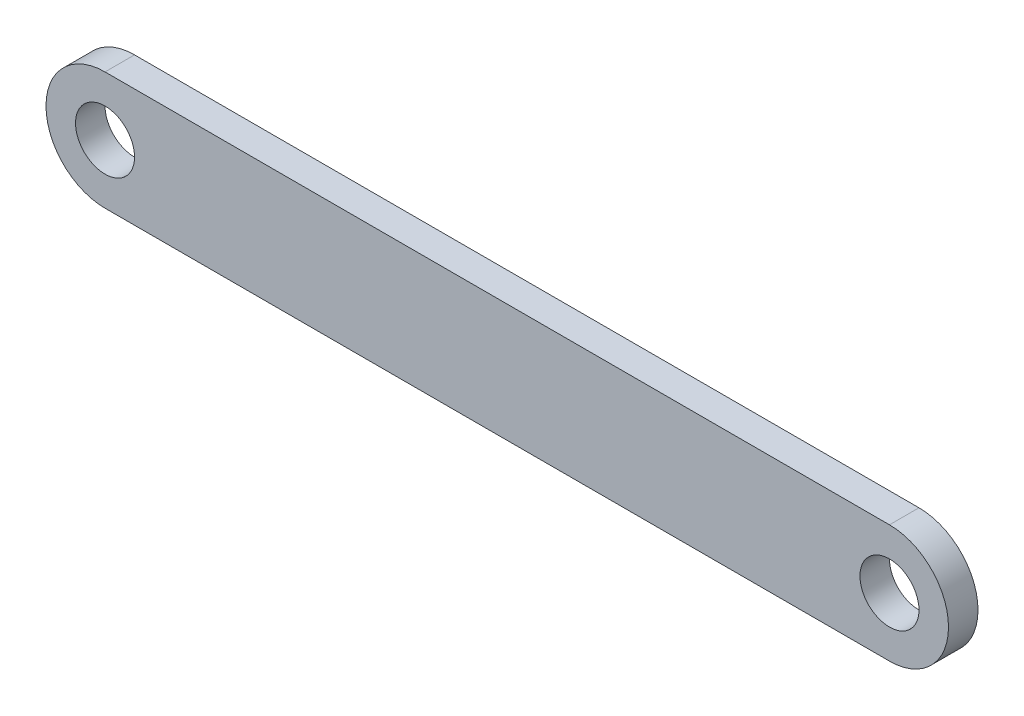
ISO-10303-21;
HEADER;
FILE_DESCRIPTION(('STEP AP214'),'2;1');
FILE_NAME('part.step','',(''),(''),'','','');
FILE_SCHEMA(('AUTOMOTIVE_DESIGN { 1 0 10303 214 1 1 1 1 }'));
ENDSEC;
DATA;
#1=APPLICATION_CONTEXT('core data for automotive mechanical design processes');
#2=APPLICATION_PROTOCOL_DEFINITION('international standard','automotive_design',2000,#1);
#3=PRODUCT_CONTEXT('',#1,'mechanical');
#4=PRODUCT('Part','Part','',(#3));
#5=PRODUCT_RELATED_PRODUCT_CATEGORY('part','',(#4));
#6=PRODUCT_DEFINITION_FORMATION('','',#4);
#7=PRODUCT_DEFINITION_CONTEXT('part definition',#1,'design');
#8=PRODUCT_DEFINITION('design','',#6,#7);
#9=PRODUCT_DEFINITION_SHAPE('','',#8);
#10=(LENGTH_UNIT() NAMED_UNIT(*) SI_UNIT(.MILLI.,.METRE.));
#11=(NAMED_UNIT(*) PLANE_ANGLE_UNIT() SI_UNIT($,.RADIAN.));
#12=(NAMED_UNIT(*) SI_UNIT($,.STERADIAN.) SOLID_ANGLE_UNIT());
#13=UNCERTAINTY_MEASURE_WITH_UNIT(LENGTH_MEASURE(1.E-05),#10,'distance_accuracy_value','');
#14=(GEOMETRIC_REPRESENTATION_CONTEXT(3) GLOBAL_UNCERTAINTY_ASSIGNED_CONTEXT((#13)) GLOBAL_UNIT_ASSIGNED_CONTEXT((#10,
#11,#12)) REPRESENTATION_CONTEXT('',''));
#15=CARTESIAN_POINT('',(0.,0.,0.));
#16=DIRECTION('',(0.,0.,1.));
#17=DIRECTION('',(1.,0.,0.));
#18=AXIS2_PLACEMENT_3D('',#15,#16,#17);
#19=CARTESIAN_POINT('',(0.,-2.,-1.));
#20=DIRECTION('',(0.,-1.,0.));
#21=DIRECTION('',(1.,0.,0.));
#22=AXIS2_PLACEMENT_3D('',#19,#20,#21);
#23=PLANE('',#22);
#24=DIRECTION('',(1.,0.,0.));
#25=VECTOR('',#24,1.);
#26=CARTESIAN_POINT('',(0.,-2.,0.));
#27=LINE('',#26,#25);
#28=CARTESIAN_POINT('',(0.,-2.,0.));
#29=VERTEX_POINT('',#28);
#30=CARTESIAN_POINT('',(26.58,-2.,0.));
#31=VERTEX_POINT('',#30);
#32=EDGE_CURVE('E110',#29,#31,#27,.T.);
#33=ORIENTED_EDGE('',*,*,#32,.F.);
#34=DIRECTION('',(0.,0.,1.));
#35=VECTOR('',#34,1.);
#36=CARTESIAN_POINT('',(0.,-2.,-1.));
#37=LINE('',#36,#35);
#38=CARTESIAN_POINT('',(0.,-2.,-1.));
#39=VERTEX_POINT('',#38);
#40=EDGE_CURVE('E11',#39,#29,#37,.T.);
#41=ORIENTED_EDGE('',*,*,#40,.F.);
#42=DIRECTION('',(1.,0.,0.));
#43=VECTOR('',#42,1.);
#44=CARTESIAN_POINT('',(0.,-2.,-1.));
#45=LINE('',#44,#43);
#46=CARTESIAN_POINT('',(26.58,-2.,-1.));
#47=VERTEX_POINT('',#46);
#48=EDGE_CURVE('E98',#39,#47,#45,.T.);
#49=ORIENTED_EDGE('',*,*,#48,.T.);
#50=DIRECTION('',(0.,0.,1.));
#51=VECTOR('',#50,1.);
#52=CARTESIAN_POINT('',(26.58,-2.,-1.));
#53=LINE('',#52,#51);
#54=EDGE_CURVE('E42',#47,#31,#53,.T.);
#55=ORIENTED_EDGE('',*,*,#54,.T.);
#56=EDGE_LOOP('',(#33,#41,#49,#55));
#57=FACE_BOUND('',#56,.T.);
#58=ADVANCED_FACE('F39',(#57),#23,.T.);
#59=CARTESIAN_POINT('',(0.,0.,-1.));
#60=DIRECTION('',(0.,0.,1.));
#61=DIRECTION('',(1.,0.,0.));
#62=AXIS2_PLACEMENT_3D('',#59,#60,#61);
#63=CYLINDRICAL_SURFACE('',#62,2.);
#64=CARTESIAN_POINT('',(0.,0.,0.));
#65=DIRECTION('',(0.,0.,1.));
#66=DIRECTION('',(1.,0.,0.));
#67=AXIS2_PLACEMENT_3D('',#64,#65,#66);
#68=CIRCLE('',#67,2.);
#69=CARTESIAN_POINT('',(0.,2.,0.));
#70=VERTEX_POINT('',#69);
#71=EDGE_CURVE('E116',#70,#29,#68,.T.);
#72=ORIENTED_EDGE('',*,*,#71,.F.);
#73=DIRECTION('',(0.,0.,1.));
#74=VECTOR('',#73,1.);
#75=CARTESIAN_POINT('',(0.,2.,-1.));
#76=LINE('',#75,#74);
#77=CARTESIAN_POINT('',(0.,2.,-1.));
#78=VERTEX_POINT('',#77);
#79=EDGE_CURVE('E48',#78,#70,#76,.T.);
#80=ORIENTED_EDGE('',*,*,#79,.F.);
#81=CARTESIAN_POINT('',(0.,0.,-1.));
#82=DIRECTION('',(0.,0.,1.));
#83=DIRECTION('',(1.,0.,0.));
#84=AXIS2_PLACEMENT_3D('',#81,#82,#83);
#85=CIRCLE('',#84,2.);
#86=EDGE_CURVE('E91',#78,#39,#85,.T.);
#87=ORIENTED_EDGE('',*,*,#86,.T.);
#88=ORIENTED_EDGE('',*,*,#40,.T.);
#89=EDGE_LOOP('',(#72,#80,#87,#88));
#90=FACE_BOUND('',#89,.T.);
#91=ADVANCED_FACE('F139',(#90),#63,.T.);
#92=CARTESIAN_POINT('',(0.,2.,-1.));
#93=DIRECTION('',(0.,-1.,0.));
#94=DIRECTION('',(1.,0.,0.));
#95=AXIS2_PLACEMENT_3D('',#92,#93,#94);
#96=PLANE('',#95);
#97=DIRECTION('',(1.,0.,0.));
#98=VECTOR('',#97,1.);
#99=CARTESIAN_POINT('',(0.,2.,0.));
#100=LINE('',#99,#98);
#101=CARTESIAN_POINT('',(26.58,2.,0.));
#102=VERTEX_POINT('',#101);
#103=EDGE_CURVE('E95',#70,#102,#100,.T.);
#104=ORIENTED_EDGE('',*,*,#103,.T.);
#105=DIRECTION('',(0.,0.,1.));
#106=VECTOR('',#105,1.);
#107=CARTESIAN_POINT('',(26.58,2.,-1.));
#108=LINE('',#107,#106);
#109=CARTESIAN_POINT('',(26.58,2.,-1.));
#110=VERTEX_POINT('',#109);
#111=EDGE_CURVE('E93',#110,#102,#108,.T.);
#112=ORIENTED_EDGE('',*,*,#111,.F.);
#113=DIRECTION('',(1.,0.,0.));
#114=VECTOR('',#113,1.);
#115=CARTESIAN_POINT('',(0.,2.,-1.));
#116=LINE('',#115,#114);
#117=EDGE_CURVE('E86',#78,#110,#116,.T.);
#118=ORIENTED_EDGE('',*,*,#117,.F.);
#119=ORIENTED_EDGE('',*,*,#79,.T.);
#120=EDGE_LOOP('',(#104,#112,#118,#119));
#121=FACE_BOUND('',#120,.T.);
#122=ADVANCED_FACE('F94',(#121),#96,.F.);
#123=CARTESIAN_POINT('',(0.,0.,-1.));
#124=DIRECTION('',(0.,0.,1.));
#125=DIRECTION('',(1.,0.,0.));
#126=AXIS2_PLACEMENT_3D('',#123,#124,#125);
#127=CYLINDRICAL_SURFACE('',#126,1.);
#128=CARTESIAN_POINT('',(0.,0.,-1.));
#129=DIRECTION('',(0.,0.,1.));
#130=DIRECTION('',(1.,0.,0.));
#131=AXIS2_PLACEMENT_3D('',#128,#129,#130);
#132=CIRCLE('',#131,1.);
#133=CARTESIAN_POINT('',(1.,0.,-1.));
#134=VERTEX_POINT('',#133);
#135=EDGE_CURVE('E104',#134,#134,#132,.T.);
#136=ORIENTED_EDGE('',*,*,#135,.F.);
#137=EDGE_LOOP('',(#136));
#138=FACE_BOUND('',#137,.T.);
#139=CARTESIAN_POINT('',(0.,0.,0.));
#140=DIRECTION('',(0.,0.,1.));
#141=DIRECTION('',(1.,0.,0.));
#142=AXIS2_PLACEMENT_3D('',#139,#140,#141);
#143=CIRCLE('',#142,1.);
#144=CARTESIAN_POINT('',(1.,0.,0.));
#145=VERTEX_POINT('',#144);
#146=EDGE_CURVE('E119',#145,#145,#143,.T.);
#147=ORIENTED_EDGE('',*,*,#146,.T.);
#148=EDGE_LOOP('',(#147));
#149=FACE_BOUND('',#148,.T.);
#150=ADVANCED_FACE('F147',(#138,#149),#127,.F.);
#151=CARTESIAN_POINT('',(26.58,0.,-1.));
#152=DIRECTION('',(0.,0.,1.));
#153=DIRECTION('',(1.,0.,0.));
#154=AXIS2_PLACEMENT_3D('',#151,#152,#153);
#155=CYLINDRICAL_SURFACE('',#154,2.);
#156=CARTESIAN_POINT('',(26.58,0.,0.));
#157=DIRECTION('',(0.,0.,1.));
#158=DIRECTION('',(1.,0.,0.));
#159=AXIS2_PLACEMENT_3D('',#156,#157,#158);
#160=CIRCLE('',#159,2.);
#161=EDGE_CURVE('E113',#31,#102,#160,.T.);
#162=ORIENTED_EDGE('',*,*,#161,.F.);
#163=ORIENTED_EDGE('',*,*,#54,.F.);
#164=CARTESIAN_POINT('',(26.58,0.,-1.));
#165=DIRECTION('',(0.,0.,1.));
#166=DIRECTION('',(1.,0.,0.));
#167=AXIS2_PLACEMENT_3D('',#164,#165,#166);
#168=CIRCLE('',#167,2.);
#169=EDGE_CURVE('E90',#47,#110,#168,.T.);
#170=ORIENTED_EDGE('',*,*,#169,.T.);
#171=ORIENTED_EDGE('',*,*,#111,.T.);
#172=EDGE_LOOP('',(#162,#163,#170,#171));
#173=FACE_BOUND('',#172,.T.);
#174=ADVANCED_FACE('F97',(#173),#155,.T.);
#175=CARTESIAN_POINT('',(26.58,0.,-1.));
#176=DIRECTION('',(0.,0.,1.));
#177=DIRECTION('',(1.,0.,0.));
#178=AXIS2_PLACEMENT_3D('',#175,#176,#177);
#179=CYLINDRICAL_SURFACE('',#178,0.999999999999998);
#180=CARTESIAN_POINT('',(26.58,0.,-1.));
#181=DIRECTION('',(0.,0.,1.));
#182=DIRECTION('',(1.,0.,0.));
#183=AXIS2_PLACEMENT_3D('',#180,#181,#182);
#184=CIRCLE('',#183,0.999999999999998);
#185=CARTESIAN_POINT('',(27.58,0.,-1.));
#186=VERTEX_POINT('',#185);
#187=EDGE_CURVE('E107',#186,#186,#184,.T.);
#188=ORIENTED_EDGE('',*,*,#187,.F.);
#189=EDGE_LOOP('',(#188));
#190=FACE_BOUND('',#189,.T.);
#191=CARTESIAN_POINT('',(26.58,0.,0.));
#192=DIRECTION('',(0.,0.,1.));
#193=DIRECTION('',(1.,0.,0.));
#194=AXIS2_PLACEMENT_3D('',#191,#192,#193);
#195=CIRCLE('',#194,0.999999999999998);
#196=CARTESIAN_POINT('',(27.58,0.,0.));
#197=VERTEX_POINT('',#196);
#198=EDGE_CURVE('E100',#197,#197,#195,.T.);
#199=ORIENTED_EDGE('',*,*,#198,.T.);
#200=EDGE_LOOP('',(#199));
#201=FACE_BOUND('',#200,.T.);
#202=ADVANCED_FACE('F126',(#190,#201),#179,.F.);
#203=CARTESIAN_POINT('',(0.,0.,-1.));
#204=DIRECTION('',(0.,0.,1.));
#205=DIRECTION('',(1.,0.,0.));
#206=AXIS2_PLACEMENT_3D('',#203,#204,#205);
#207=PLANE('',#206);
#208=ORIENTED_EDGE('',*,*,#48,.F.);
#209=ORIENTED_EDGE('',*,*,#86,.F.);
#210=ORIENTED_EDGE('',*,*,#117,.T.);
#211=ORIENTED_EDGE('',*,*,#169,.F.);
#212=EDGE_LOOP('',(#208,#209,#210,#211));
#213=FACE_BOUND('',#212,.T.);
#214=ORIENTED_EDGE('',*,*,#135,.T.);
#215=EDGE_LOOP('',(#214));
#216=FACE_BOUND('',#215,.T.);
#217=ORIENTED_EDGE('',*,*,#187,.T.);
#218=EDGE_LOOP('',(#217));
#219=FACE_BOUND('',#218,.T.);
#220=ADVANCED_FACE('F88',(#213,#216,#219),#207,.F.);
#221=CARTESIAN_POINT('',(0.,0.,0.));
#222=DIRECTION('',(0.,0.,1.));
#223=DIRECTION('',(1.,0.,0.));
#224=AXIS2_PLACEMENT_3D('',#221,#222,#223);
#225=PLANE('',#224);
#226=ORIENTED_EDGE('',*,*,#32,.T.);
#227=ORIENTED_EDGE('',*,*,#161,.T.);
#228=ORIENTED_EDGE('',*,*,#103,.F.);
#229=ORIENTED_EDGE('',*,*,#71,.T.);
#230=EDGE_LOOP('',(#226,#227,#228,#229));
#231=FACE_BOUND('',#230,.T.);
#232=ORIENTED_EDGE('',*,*,#146,.F.);
#233=EDGE_LOOP('',(#232));
#234=FACE_BOUND('',#233,.T.);
#235=ORIENTED_EDGE('',*,*,#198,.F.);
#236=EDGE_LOOP('',(#235));
#237=FACE_BOUND('',#236,.T.);
#238=ADVANCED_FACE('F128',(#231,#234,#237),#225,.T.);
#239=CLOSED_SHELL('',(#58,#91,#122,#150,#174,#202,#220,#238));
#240=MANIFOLD_SOLID_BREP('B2',#239);
#241=ADVANCED_BREP_SHAPE_REPRESENTATION('',(#18,#240),#14);
#242=SHAPE_DEFINITION_REPRESENTATION(#9,#241);
ENDSEC;
END-ISO-10303-21;
